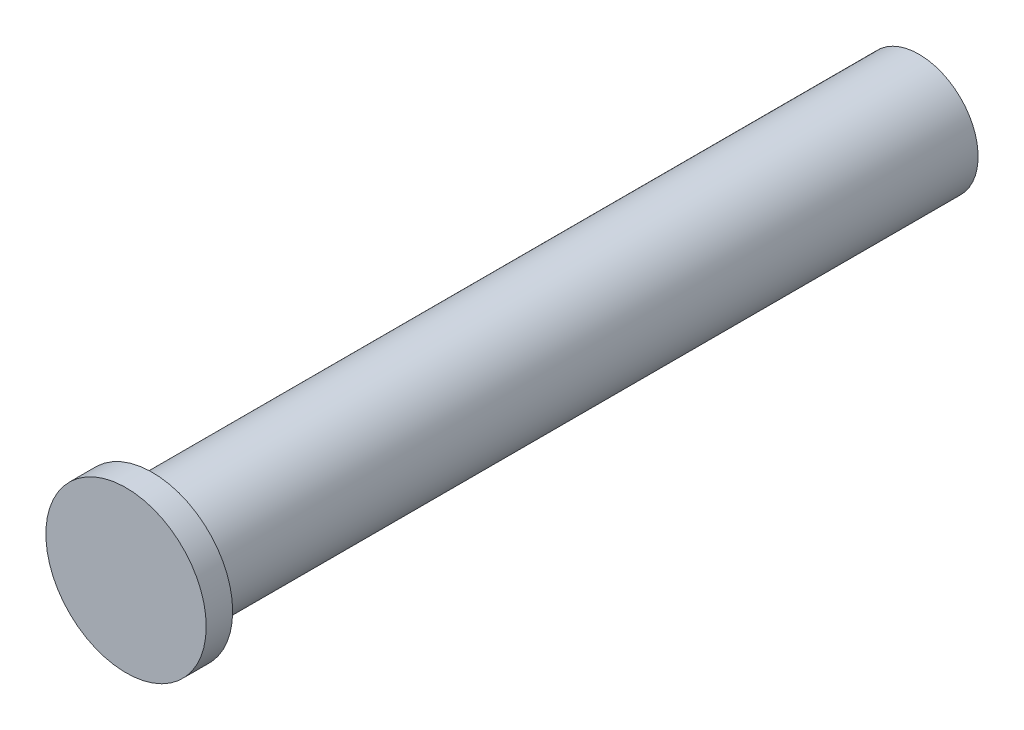
ISO-10303-21;
HEADER;
FILE_DESCRIPTION(('STEP AP214'),'2;1');
FILE_NAME('part.step','',(''),(''),'','','');
FILE_SCHEMA(('AUTOMOTIVE_DESIGN { 1 0 10303 214 1 1 1 1 }'));
ENDSEC;
DATA;
#1=APPLICATION_CONTEXT('core data for automotive mechanical design processes');
#2=APPLICATION_PROTOCOL_DEFINITION('international standard','automotive_design',2000,#1);
#3=PRODUCT_CONTEXT('',#1,'mechanical');
#4=PRODUCT('Part','Part','',(#3));
#5=PRODUCT_RELATED_PRODUCT_CATEGORY('part','',(#4));
#6=PRODUCT_DEFINITION_FORMATION('','',#4);
#7=PRODUCT_DEFINITION_CONTEXT('part definition',#1,'design');
#8=PRODUCT_DEFINITION('design','',#6,#7);
#9=PRODUCT_DEFINITION_SHAPE('','',#8);
#10=(LENGTH_UNIT() NAMED_UNIT(*) SI_UNIT(.MILLI.,.METRE.));
#11=(NAMED_UNIT(*) PLANE_ANGLE_UNIT() SI_UNIT($,.RADIAN.));
#12=(NAMED_UNIT(*) SI_UNIT($,.STERADIAN.) SOLID_ANGLE_UNIT());
#13=UNCERTAINTY_MEASURE_WITH_UNIT(LENGTH_MEASURE(1.E-05),#10,'distance_accuracy_value','');
#14=(GEOMETRIC_REPRESENTATION_CONTEXT(3) GLOBAL_UNCERTAINTY_ASSIGNED_CONTEXT((#13)) GLOBAL_UNIT_ASSIGNED_CONTEXT((#10,
#11,#12)) REPRESENTATION_CONTEXT('',''));
#15=CARTESIAN_POINT('',(0.,0.,0.));
#16=DIRECTION('',(0.,0.,1.));
#17=DIRECTION('',(1.,0.,0.));
#18=AXIS2_PLACEMENT_3D('',#15,#16,#17);
#19=CARTESIAN_POINT('',(0.,0.,-3.));
#20=DIRECTION('',(0.,0.,1.));
#21=DIRECTION('',(1.,0.,0.));
#22=AXIS2_PLACEMENT_3D('',#19,#20,#21);
#23=CYLINDRICAL_SURFACE('',#22,9.1);
#24=CARTESIAN_POINT('',(0.,0.,-3.));
#25=DIRECTION('',(0.,0.,1.));
#26=DIRECTION('',(1.,0.,0.));
#27=AXIS2_PLACEMENT_3D('',#24,#25,#26);
#28=CIRCLE('',#27,9.1);
#29=CARTESIAN_POINT('',(9.1,0.,-3.));
#30=VERTEX_POINT('',#29);
#31=EDGE_CURVE('E49',#30,#30,#28,.T.);
#32=ORIENTED_EDGE('',*,*,#31,.T.);
#33=EDGE_LOOP('',(#32));
#34=FACE_BOUND('',#33,.T.);
#35=CARTESIAN_POINT('',(0.,0.,0.));
#36=DIRECTION('',(0.,0.,1.));
#37=DIRECTION('',(1.,0.,0.));
#38=AXIS2_PLACEMENT_3D('',#35,#36,#37);
#39=CIRCLE('',#38,9.1);
#40=CARTESIAN_POINT('',(9.1,0.,0.));
#41=VERTEX_POINT('',#40);
#42=EDGE_CURVE('E44',#41,#41,#39,.T.);
#43=ORIENTED_EDGE('',*,*,#42,.F.);
#44=EDGE_LOOP('',(#43));
#45=FACE_BOUND('',#44,.T.);
#46=ADVANCED_FACE('F41',(#34,#45),#23,.T.);
#47=CARTESIAN_POINT('',(0.,0.,-3.));
#48=DIRECTION('',(0.,0.,1.));
#49=DIRECTION('',(1.,0.,0.));
#50=AXIS2_PLACEMENT_3D('',#47,#48,#49);
#51=PLANE('',#50);
#52=CARTESIAN_POINT('',(0.,0.,-3.));
#53=DIRECTION('',(0.,0.,-1.));
#54=DIRECTION('',(-1.,0.,0.));
#55=AXIS2_PLACEMENT_3D('',#52,#53,#54);
#56=CIRCLE('',#55,6.7);
#57=CARTESIAN_POINT('',(-6.7,0.,-3.));
#58=VERTEX_POINT('',#57);
#59=EDGE_CURVE('E11',#58,#58,#56,.T.);
#60=ORIENTED_EDGE('',*,*,#59,.F.);
#61=EDGE_LOOP('',(#60));
#62=FACE_BOUND('',#61,.T.);
#63=ORIENTED_EDGE('',*,*,#31,.F.);
#64=EDGE_LOOP('',(#63));
#65=FACE_BOUND('',#64,.T.);
#66=ADVANCED_FACE('F98',(#62,#65),#51,.F.);
#67=CARTESIAN_POINT('',(0.,0.,0.));
#68=DIRECTION('',(0.,0.,1.));
#69=DIRECTION('',(1.,0.,0.));
#70=AXIS2_PLACEMENT_3D('',#67,#68,#69);
#71=PLANE('',#70);
#72=ORIENTED_EDGE('',*,*,#42,.T.);
#73=EDGE_LOOP('',(#72));
#74=FACE_BOUND('',#73,.T.);
#75=ADVANCED_FACE('F95',(#74),#71,.T.);
#76=CARTESIAN_POINT('',(0.,0.,-90.));
#77=DIRECTION('',(0.,0.,1.));
#78=DIRECTION('',(1.,0.,0.));
#79=AXIS2_PLACEMENT_3D('',#76,#77,#78);
#80=CYLINDRICAL_SURFACE('',#79,6.7);
#81=CARTESIAN_POINT('',(0.,0.,-90.));
#82=DIRECTION('',(0.,0.,-1.));
#83=DIRECTION('',(-1.,0.,0.));
#84=AXIS2_PLACEMENT_3D('',#81,#82,#83);
#85=CIRCLE('',#84,6.7);
#86=CARTESIAN_POINT('',(-6.7,0.,-90.));
#87=VERTEX_POINT('',#86);
#88=EDGE_CURVE('E87',#87,#87,#85,.T.);
#89=ORIENTED_EDGE('',*,*,#88,.F.);
#90=EDGE_LOOP('',(#89));
#91=FACE_BOUND('',#90,.T.);
#92=ORIENTED_EDGE('',*,*,#59,.T.);
#93=EDGE_LOOP('',(#92));
#94=FACE_BOUND('',#93,.T.);
#95=ADVANCED_FACE('F107',(#91,#94),#80,.T.);
#96=CARTESIAN_POINT('',(0.,0.,-90.));
#97=DIRECTION('',(0.,0.,-1.));
#98=DIRECTION('',(-1.,0.,0.));
#99=AXIS2_PLACEMENT_3D('',#96,#97,#98);
#100=PLANE('',#99);
#101=CARTESIAN_POINT('',(2.59807621135313,-1.50000000000011,-90.));
#102=DIRECTION('',(0.,0.,-1.));
#103=DIRECTION('',(-1.,0.,0.));
#104=AXIS2_PLACEMENT_3D('',#101,#102,#103);
#105=CIRCLE('',#104,0.79999999999999);
#106=CARTESIAN_POINT('',(1.79807621135314,-1.50000000000011,-90.));
#107=VERTEX_POINT('',#106);
#108=EDGE_CURVE('E71',#107,#107,#105,.T.);
#109=ORIENTED_EDGE('',*,*,#108,.F.);
#110=EDGE_LOOP('',(#109));
#111=FACE_BOUND('',#110,.T.);
#112=CARTESIAN_POINT('',(0.,3.,-90.));
#113=DIRECTION('',(0.,0.,-1.));
#114=DIRECTION('',(-1.,0.,0.));
#115=AXIS2_PLACEMENT_3D('',#112,#113,#114);
#116=CIRCLE('',#115,0.79999999999999);
#117=CARTESIAN_POINT('',(-0.79999999999999,3.,-90.));
#118=VERTEX_POINT('',#117);
#119=EDGE_CURVE('E70',#118,#118,#116,.T.);
#120=ORIENTED_EDGE('',*,*,#119,.F.);
#121=EDGE_LOOP('',(#120));
#122=FACE_BOUND('',#121,.T.);
#123=CARTESIAN_POINT('',(-2.59807621135351,-1.49999999999989,-90.));
#124=DIRECTION('',(0.,0.,-1.));
#125=DIRECTION('',(-1.,0.,0.));
#126=AXIS2_PLACEMENT_3D('',#123,#124,#125);
#127=CIRCLE('',#126,0.79999999999999);
#128=CARTESIAN_POINT('',(-3.3980762113535,-1.49999999999989,-90.));
#129=VERTEX_POINT('',#128);
#130=EDGE_CURVE('E81',#129,#129,#127,.T.);
#131=ORIENTED_EDGE('',*,*,#130,.F.);
#132=EDGE_LOOP('',(#131));
#133=FACE_BOUND('',#132,.T.);
#134=ORIENTED_EDGE('',*,*,#88,.T.);
#135=EDGE_LOOP('',(#134));
#136=FACE_BOUND('',#135,.T.);
#137=ADVANCED_FACE('F113',(#111,#122,#133,#136),#100,.T.);
#138=CARTESIAN_POINT('',(-2.59807621135351,-1.49999999999989,-80.));
#139=DIRECTION('',(0.,0.,-1.));
#140=DIRECTION('',(-1.,0.,0.));
#141=AXIS2_PLACEMENT_3D('',#138,#139,#140);
#142=CONICAL_SURFACE('',#141,0.799999999999998,1.02974425867665);
#143=CARTESIAN_POINT('',(-2.59807621135351,-1.49999999999989,-79.5193115047779));
#144=VERTEX_POINT('',#143);
#145=VERTEX_LOOP('',#144);
#146=FACE_BOUND('',#145,.T.);
#147=CARTESIAN_POINT('',(-2.59807621135351,-1.49999999999989,-80.));
#148=DIRECTION('',(0.,0.,-1.));
#149=DIRECTION('',(-1.,0.,0.));
#150=AXIS2_PLACEMENT_3D('',#147,#148,#149);
#151=CIRCLE('',#150,0.799999999999998);
#152=CARTESIAN_POINT('',(-3.39807621135351,-1.49999999999989,-80.));
#153=VERTEX_POINT('',#152);
#154=EDGE_CURVE('E84',#153,#153,#151,.T.);
#155=ORIENTED_EDGE('',*,*,#154,.T.);
#156=EDGE_LOOP('',(#155));
#157=FACE_BOUND('',#156,.T.);
#158=ADVANCED_FACE('F117',(#146,#157),#142,.F.);
#159=CARTESIAN_POINT('',(-2.59807621135351,-1.49999999999989,-90.));
#160=DIRECTION('',(0.,0.,-1.));
#161=DIRECTION('',(-1.,0.,0.));
#162=AXIS2_PLACEMENT_3D('',#159,#160,#161);
#163=CYLINDRICAL_SURFACE('',#162,0.799999999999994);
#164=ORIENTED_EDGE('',*,*,#154,.F.);
#165=EDGE_LOOP('',(#164));
#166=FACE_BOUND('',#165,.T.);
#167=ORIENTED_EDGE('',*,*,#130,.T.);
#168=EDGE_LOOP('',(#167));
#169=FACE_BOUND('',#168,.T.);
#170=ADVANCED_FACE('F121',(#166,#169),#163,.F.);
#171=CARTESIAN_POINT('',(0.,3.,-80.));
#172=DIRECTION('',(0.,0.,-1.));
#173=DIRECTION('',(-1.,0.,0.));
#174=AXIS2_PLACEMENT_3D('',#171,#172,#173);
#175=CONICAL_SURFACE('',#174,0.799999999999998,1.02974425867665);
#176=CARTESIAN_POINT('',(0.,3.,-79.5193115047779));
#177=VERTEX_POINT('',#176);
#178=VERTEX_LOOP('',#177);
#179=FACE_BOUND('',#178,.T.);
#180=CARTESIAN_POINT('',(0.,3.,-80.));
#181=DIRECTION('',(0.,0.,-1.));
#182=DIRECTION('',(-1.,0.,0.));
#183=AXIS2_PLACEMENT_3D('',#180,#181,#182);
#184=CIRCLE('',#183,0.799999999999998);
#185=CARTESIAN_POINT('',(-0.799999999999998,3.,-80.));
#186=VERTEX_POINT('',#185);
#187=EDGE_CURVE('E74',#186,#186,#184,.T.);
#188=ORIENTED_EDGE('',*,*,#187,.T.);
#189=EDGE_LOOP('',(#188));
#190=FACE_BOUND('',#189,.T.);
#191=ADVANCED_FACE('F124',(#179,#190),#175,.F.);
#192=CARTESIAN_POINT('',(0.,3.,-90.));
#193=DIRECTION('',(0.,0.,-1.));
#194=DIRECTION('',(-1.,0.,0.));
#195=AXIS2_PLACEMENT_3D('',#192,#193,#194);
#196=CYLINDRICAL_SURFACE('',#195,0.799999999999994);
#197=ORIENTED_EDGE('',*,*,#187,.F.);
#198=EDGE_LOOP('',(#197));
#199=FACE_BOUND('',#198,.T.);
#200=ORIENTED_EDGE('',*,*,#119,.T.);
#201=EDGE_LOOP('',(#200));
#202=FACE_BOUND('',#201,.T.);
#203=ADVANCED_FACE('F64',(#199,#202),#196,.F.);
#204=CARTESIAN_POINT('',(2.59807621135313,-1.50000000000011,-80.));
#205=DIRECTION('',(0.,0.,-1.));
#206=DIRECTION('',(-1.,0.,0.));
#207=AXIS2_PLACEMENT_3D('',#204,#205,#206);
#208=CONICAL_SURFACE('',#207,0.799999999999998,1.02974425867665);
#209=CARTESIAN_POINT('',(2.59807621135312,-1.50000000000011,-79.5193115047779));
#210=VERTEX_POINT('',#209);
#211=VERTEX_LOOP('',#210);
#212=FACE_BOUND('',#211,.T.);
#213=CARTESIAN_POINT('',(2.59807621135313,-1.50000000000011,-80.));
#214=DIRECTION('',(0.,0.,-1.));
#215=DIRECTION('',(-1.,0.,0.));
#216=AXIS2_PLACEMENT_3D('',#213,#214,#215);
#217=CIRCLE('',#216,0.799999999999998);
#218=CARTESIAN_POINT('',(1.79807621135313,-1.50000000000011,-80.));
#219=VERTEX_POINT('',#218);
#220=EDGE_CURVE('E68',#219,#219,#217,.T.);
#221=ORIENTED_EDGE('',*,*,#220,.T.);
#222=EDGE_LOOP('',(#221));
#223=FACE_BOUND('',#222,.T.);
#224=ADVANCED_FACE('F60',(#212,#223),#208,.F.);
#225=CARTESIAN_POINT('',(2.59807621135313,-1.50000000000011,-90.));
#226=DIRECTION('',(0.,0.,-1.));
#227=DIRECTION('',(-1.,0.,0.));
#228=AXIS2_PLACEMENT_3D('',#225,#226,#227);
#229=CYLINDRICAL_SURFACE('',#228,0.799999999999994);
#230=ORIENTED_EDGE('',*,*,#220,.F.);
#231=EDGE_LOOP('',(#230));
#232=FACE_BOUND('',#231,.T.);
#233=ORIENTED_EDGE('',*,*,#108,.T.);
#234=EDGE_LOOP('',(#233));
#235=FACE_BOUND('',#234,.T.);
#236=ADVANCED_FACE('F63',(#232,#235),#229,.F.);
#237=CLOSED_SHELL('',(#46,#66,#75,#95,#137,#158,#170,#191,#203,#224,#236));
#238=MANIFOLD_SOLID_BREP('B2',#237);
#239=ADVANCED_BREP_SHAPE_REPRESENTATION('',(#18,#238),#14);
#240=SHAPE_DEFINITION_REPRESENTATION(#9,#239);
ENDSEC;
END-ISO-10303-21;
